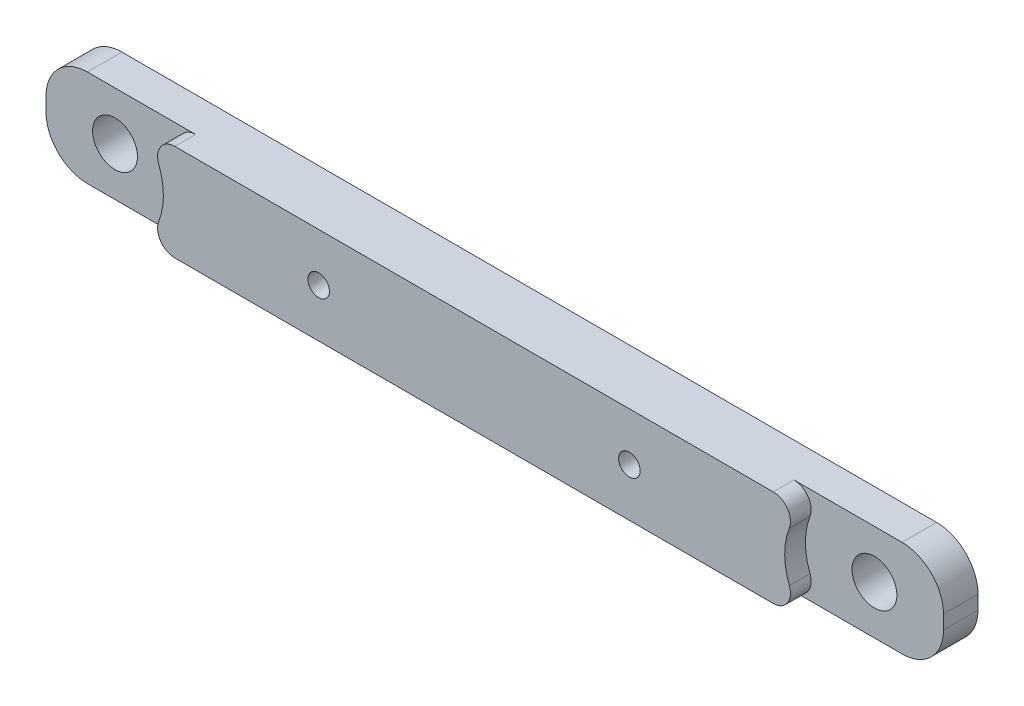
ISO-10303-21;
HEADER;
FILE_DESCRIPTION(('STEP AP214'),'2;1');
FILE_NAME('part.step','',(''),(''),'','','');
FILE_SCHEMA(('AUTOMOTIVE_DESIGN { 1 0 10303 214 1 1 1 1 }'));
ENDSEC;
DATA;
#1=APPLICATION_CONTEXT('core data for automotive mechanical design processes');
#2=APPLICATION_PROTOCOL_DEFINITION('international standard','automotive_design',2000,#1);
#3=PRODUCT_CONTEXT('',#1,'mechanical');
#4=PRODUCT('Part','Part','',(#3));
#5=PRODUCT_RELATED_PRODUCT_CATEGORY('part','',(#4));
#6=PRODUCT_DEFINITION_FORMATION('','',#4);
#7=PRODUCT_DEFINITION_CONTEXT('part definition',#1,'design');
#8=PRODUCT_DEFINITION('design','',#6,#7);
#9=PRODUCT_DEFINITION_SHAPE('','',#8);
#10=(LENGTH_UNIT() NAMED_UNIT(*) SI_UNIT(.MILLI.,.METRE.));
#11=(NAMED_UNIT(*) PLANE_ANGLE_UNIT() SI_UNIT($,.RADIAN.));
#12=(NAMED_UNIT(*) SI_UNIT($,.STERADIAN.) SOLID_ANGLE_UNIT());
#13=UNCERTAINTY_MEASURE_WITH_UNIT(LENGTH_MEASURE(1.E-05),#10,'distance_accuracy_value','');
#14=(GEOMETRIC_REPRESENTATION_CONTEXT(3) GLOBAL_UNCERTAINTY_ASSIGNED_CONTEXT((#13)) GLOBAL_UNIT_ASSIGNED_CONTEXT((#10,
#11,#12)) REPRESENTATION_CONTEXT('',''));
#15=CARTESIAN_POINT('',(0.,0.,0.));
#16=DIRECTION('',(0.,0.,1.));
#17=DIRECTION('',(1.,0.,0.));
#18=AXIS2_PLACEMENT_3D('',#15,#16,#17);
#19=CARTESIAN_POINT('',(-55.,0.,-25.05));
#20=DIRECTION('',(0.,0.,-1.));
#21=DIRECTION('',(1.,0.,0.));
#22=AXIS2_PLACEMENT_3D('',#19,#20,#21);
#23=CYLINDRICAL_SURFACE('',#22,3.25);
#24=CARTESIAN_POINT('',(-55.,0.,-33.05));
#25=DIRECTION('',(0.,0.,1.));
#26=DIRECTION('',(1.,0.,0.));
#27=AXIS2_PLACEMENT_3D('',#24,#25,#26);
#28=CIRCLE('',#27,3.25);
#29=CARTESIAN_POINT('',(-58.25,0.,-33.05));
#30=VERTEX_POINT('',#29);
#31=EDGE_CURVE('E237',#30,#30,#28,.T.);
#32=ORIENTED_EDGE('',*,*,#31,.F.);
#33=DIRECTION('',(0.,0.,1.));
#34=VECTOR('',#33,1.);
#35=CARTESIAN_POINT('',(-58.25,0.,-25.05));
#36=LINE('',#35,#34);
#37=CARTESIAN_POINT('',(-58.25,0.,-28.05));
#38=VERTEX_POINT('',#37);
#39=EDGE_CURVE('E11',#30,#38,#36,.T.);
#40=ORIENTED_EDGE('',*,*,#39,.T.);
#41=CARTESIAN_POINT('',(-55.,0.,-28.05));
#42=DIRECTION('',(0.,0.,1.));
#43=DIRECTION('',(1.,0.,0.));
#44=AXIS2_PLACEMENT_3D('',#41,#42,#43);
#45=CIRCLE('',#44,3.25);
#46=EDGE_CURVE('E293',#38,#38,#45,.T.);
#47=ORIENTED_EDGE('',*,*,#46,.T.);
#48=ORIENTED_EDGE('',*,*,#39,.F.);
#49=EDGE_LOOP('',(#32,#40,#47,#48));
#50=FACE_BOUND('',#49,.T.);
#51=ADVANCED_FACE('F16',(#50),#23,.F.);
#52=CARTESIAN_POINT('',(55.,0.,-25.05));
#53=DIRECTION('',(0.,0.,-1.));
#54=DIRECTION('',(1.,0.,0.));
#55=AXIS2_PLACEMENT_3D('',#52,#53,#54);
#56=CYLINDRICAL_SURFACE('',#55,3.25);
#57=CARTESIAN_POINT('',(55.,0.,-33.05));
#58=DIRECTION('',(0.,0.,1.));
#59=DIRECTION('',(1.,0.,0.));
#60=AXIS2_PLACEMENT_3D('',#57,#58,#59);
#61=CIRCLE('',#60,3.25);
#62=CARTESIAN_POINT('',(51.75,0.,-33.05));
#63=VERTEX_POINT('',#62);
#64=EDGE_CURVE('E212',#63,#63,#61,.T.);
#65=ORIENTED_EDGE('',*,*,#64,.F.);
#66=DIRECTION('',(0.,0.,1.));
#67=VECTOR('',#66,1.);
#68=CARTESIAN_POINT('',(51.75,0.,-25.05));
#69=LINE('',#68,#67);
#70=CARTESIAN_POINT('',(51.75,0.,-28.05));
#71=VERTEX_POINT('',#70);
#72=EDGE_CURVE('E27',#63,#71,#69,.T.);
#73=ORIENTED_EDGE('',*,*,#72,.T.);
#74=CARTESIAN_POINT('',(55.,0.,-28.05));
#75=DIRECTION('',(0.,0.,1.));
#76=DIRECTION('',(1.,0.,0.));
#77=AXIS2_PLACEMENT_3D('',#74,#75,#76);
#78=CIRCLE('',#77,3.25);
#79=EDGE_CURVE('E248',#71,#71,#78,.T.);
#80=ORIENTED_EDGE('',*,*,#79,.T.);
#81=ORIENTED_EDGE('',*,*,#72,.F.);
#82=EDGE_LOOP('',(#65,#73,#80,#81));
#83=FACE_BOUND('',#82,.T.);
#84=ADVANCED_FACE('F902',(#83),#56,.F.);
#85=CARTESIAN_POINT('',(59.,1.,-25.05));
#86=DIRECTION('',(0.,0.,-1.));
#87=DIRECTION('',(0.707106781186547,0.707106781186548,0.));
#88=AXIS2_PLACEMENT_3D('',#85,#86,#87);
#89=CYLINDRICAL_SURFACE('',#88,6.);
#90=CARTESIAN_POINT('',(59.,1.,-28.05));
#91=DIRECTION('',(0.,0.,-1.));
#92=DIRECTION('',(0.707106781186547,0.707106781186548,0.));
#93=AXIS2_PLACEMENT_3D('',#90,#91,#92);
#94=CIRCLE('',#93,6.);
#95=CARTESIAN_POINT('',(59.,7.,-28.05));
#96=VERTEX_POINT('',#95);
#97=CARTESIAN_POINT('',(65.,1.,-28.05));
#98=VERTEX_POINT('',#97);
#99=EDGE_CURVE('E279',#96,#98,#94,.T.);
#100=ORIENTED_EDGE('',*,*,#99,.T.);
#101=DIRECTION('',(0.,0.,-1.));
#102=VECTOR('',#101,1.);
#103=CARTESIAN_POINT('',(65.,1.,-25.05));
#104=LINE('',#103,#102);
#105=CARTESIAN_POINT('',(65.,1.,-33.05));
#106=VERTEX_POINT('',#105);
#107=EDGE_CURVE('E345',#98,#106,#104,.T.);
#108=ORIENTED_EDGE('',*,*,#107,.T.);
#109=CARTESIAN_POINT('',(59.,1.,-33.05));
#110=DIRECTION('',(0.,0.,-1.));
#111=DIRECTION('',(0.707106781186547,0.707106781186548,0.));
#112=AXIS2_PLACEMENT_3D('',#109,#110,#111);
#113=CIRCLE('',#112,6.);
#114=CARTESIAN_POINT('',(59.,7.,-33.05));
#115=VERTEX_POINT('',#114);
#116=EDGE_CURVE('E223',#115,#106,#113,.T.);
#117=ORIENTED_EDGE('',*,*,#116,.F.);
#118=DIRECTION('',(0.,0.,1.));
#119=VECTOR('',#118,1.);
#120=CARTESIAN_POINT('',(59.,7.,-25.05));
#121=LINE('',#120,#119);
#122=EDGE_CURVE('E244',#115,#96,#121,.T.);
#123=ORIENTED_EDGE('',*,*,#122,.T.);
#124=EDGE_LOOP('',(#100,#108,#117,#123));
#125=FACE_BOUND('',#124,.T.);
#126=ADVANCED_FACE('F894',(#125),#89,.T.);
#127=CARTESIAN_POINT('',(65.,7.,-25.05));
#128=DIRECTION('',(1.,0.,0.));
#129=DIRECTION('',(0.,1.,0.));
#130=AXIS2_PLACEMENT_3D('',#127,#128,#129);
#131=PLANE('',#130);
#132=DIRECTION('',(0.,-1.,0.));
#133=VECTOR('',#132,1.);
#134=CARTESIAN_POINT('',(65.,3.5,-28.05));
#135=LINE('',#134,#133);
#136=CARTESIAN_POINT('',(65.,-1.,-28.05));
#137=VERTEX_POINT('',#136);
#138=EDGE_CURVE('E276',#98,#137,#135,.T.);
#139=ORIENTED_EDGE('',*,*,#138,.T.);
#140=DIRECTION('',(0.,0.,1.));
#141=VECTOR('',#140,1.);
#142=CARTESIAN_POINT('',(65.,-1.,-25.05));
#143=LINE('',#142,#141);
#144=CARTESIAN_POINT('',(65.,-1.,-33.05));
#145=VERTEX_POINT('',#144);
#146=EDGE_CURVE('E20',#145,#137,#143,.T.);
#147=ORIENTED_EDGE('',*,*,#146,.F.);
#148=DIRECTION('',(0.,-1.,0.));
#149=VECTOR('',#148,1.);
#150=CARTESIAN_POINT('',(65.,7.,-33.05));
#151=LINE('',#150,#149);
#152=EDGE_CURVE('E227',#106,#145,#151,.T.);
#153=ORIENTED_EDGE('',*,*,#152,.F.);
#154=ORIENTED_EDGE('',*,*,#107,.F.);
#155=EDGE_LOOP('',(#139,#147,#153,#154));
#156=FACE_BOUND('',#155,.T.);
#157=ADVANCED_FACE('F494',(#156),#131,.T.);
#158=CARTESIAN_POINT('',(59.,-1.,-25.05));
#159=DIRECTION('',(0.,0.,-1.));
#160=DIRECTION('',(0.707106781186547,-0.707106781186548,0.));
#161=AXIS2_PLACEMENT_3D('',#158,#159,#160);
#162=CYLINDRICAL_SURFACE('',#161,6.);
#163=CARTESIAN_POINT('',(59.,-1.,-28.05));
#164=DIRECTION('',(0.,0.,-1.));
#165=DIRECTION('',(0.707106781186547,-0.707106781186548,0.));
#166=AXIS2_PLACEMENT_3D('',#163,#164,#165);
#167=CIRCLE('',#166,6.);
#168=CARTESIAN_POINT('',(59.,-7.,-28.05));
#169=VERTEX_POINT('',#168);
#170=EDGE_CURVE('E273',#137,#169,#167,.T.);
#171=ORIENTED_EDGE('',*,*,#170,.T.);
#172=DIRECTION('',(0.,0.,-1.));
#173=VECTOR('',#172,1.);
#174=CARTESIAN_POINT('',(59.,-7.,-25.05));
#175=LINE('',#174,#173);
#176=CARTESIAN_POINT('',(59.,-7.,-33.05));
#177=VERTEX_POINT('',#176);
#178=EDGE_CURVE('E217',#169,#177,#175,.T.);
#179=ORIENTED_EDGE('',*,*,#178,.T.);
#180=CARTESIAN_POINT('',(59.,-1.,-33.05));
#181=DIRECTION('',(0.,0.,-1.));
#182=DIRECTION('',(0.707106781186547,-0.707106781186548,0.));
#183=AXIS2_PLACEMENT_3D('',#180,#181,#182);
#184=CIRCLE('',#183,6.);
#185=EDGE_CURVE('E229',#145,#177,#184,.T.);
#186=ORIENTED_EDGE('',*,*,#185,.F.);
#187=ORIENTED_EDGE('',*,*,#146,.T.);
#188=EDGE_LOOP('',(#171,#179,#186,#187));
#189=FACE_BOUND('',#188,.T.);
#190=ADVANCED_FACE('F513',(#189),#162,.T.);
#191=CARTESIAN_POINT('',(-59.,1.,-25.05));
#192=DIRECTION('',(0.,0.,-1.));
#193=DIRECTION('',(-0.707106781186547,0.707106781186548,0.));
#194=AXIS2_PLACEMENT_3D('',#191,#192,#193);
#195=CYLINDRICAL_SURFACE('',#194,6.);
#196=CARTESIAN_POINT('',(-59.,1.,-28.05));
#197=DIRECTION('',(0.,0.,-1.));
#198=DIRECTION('',(-0.707106781186547,0.707106781186548,0.));
#199=AXIS2_PLACEMENT_3D('',#196,#197,#198);
#200=CIRCLE('',#199,6.);
#201=CARTESIAN_POINT('',(-65.,1.,-28.05));
#202=VERTEX_POINT('',#201);
#203=CARTESIAN_POINT('',(-59.,7.,-28.05));
#204=VERTEX_POINT('',#203);
#205=EDGE_CURVE('E292',#202,#204,#200,.T.);
#206=ORIENTED_EDGE('',*,*,#205,.T.);
#207=DIRECTION('',(0.,0.,-1.));
#208=VECTOR('',#207,1.);
#209=CARTESIAN_POINT('',(-59.,7.,-25.05));
#210=LINE('',#209,#208);
#211=CARTESIAN_POINT('',(-59.,7.,-33.05));
#212=VERTEX_POINT('',#211);
#213=EDGE_CURVE('E247',#204,#212,#210,.T.);
#214=ORIENTED_EDGE('',*,*,#213,.T.);
#215=CARTESIAN_POINT('',(-59.,1.,-33.05));
#216=DIRECTION('',(0.,0.,-1.));
#217=DIRECTION('',(-0.707106781186547,0.707106781186548,0.));
#218=AXIS2_PLACEMENT_3D('',#215,#216,#217);
#219=CIRCLE('',#218,6.);
#220=CARTESIAN_POINT('',(-65.,1.,-33.05));
#221=VERTEX_POINT('',#220);
#222=EDGE_CURVE('E328',#221,#212,#219,.T.);
#223=ORIENTED_EDGE('',*,*,#222,.F.);
#224=DIRECTION('',(0.,0.,1.));
#225=VECTOR('',#224,1.);
#226=CARTESIAN_POINT('',(-65.,1.,-25.05));
#227=LINE('',#226,#225);
#228=EDGE_CURVE('E342',#221,#202,#227,.T.);
#229=ORIENTED_EDGE('',*,*,#228,.T.);
#230=EDGE_LOOP('',(#206,#214,#223,#229));
#231=FACE_BOUND('',#230,.T.);
#232=ADVANCED_FACE('F524',(#231),#195,.T.);
#233=CARTESIAN_POINT('',(-65.,-7.,-25.05));
#234=DIRECTION('',(-1.,0.,0.));
#235=DIRECTION('',(0.,0.,1.));
#236=AXIS2_PLACEMENT_3D('',#233,#234,#235);
#237=PLANE('',#236);
#238=DIRECTION('',(0.,1.,0.));
#239=VECTOR('',#238,1.);
#240=CARTESIAN_POINT('',(-65.,-3.5,-28.05));
#241=LINE('',#240,#239);
#242=CARTESIAN_POINT('',(-65.,-1.,-28.05));
#243=VERTEX_POINT('',#242);
#244=EDGE_CURVE('E287',#243,#202,#241,.T.);
#245=ORIENTED_EDGE('',*,*,#244,.T.);
#246=ORIENTED_EDGE('',*,*,#228,.F.);
#247=DIRECTION('',(0.,1.,0.));
#248=VECTOR('',#247,1.);
#249=CARTESIAN_POINT('',(-65.,-7.,-33.05));
#250=LINE('',#249,#248);
#251=CARTESIAN_POINT('',(-65.,-1.,-33.05));
#252=VERTEX_POINT('',#251);
#253=EDGE_CURVE('E301',#252,#221,#250,.T.);
#254=ORIENTED_EDGE('',*,*,#253,.F.);
#255=DIRECTION('',(0.,0.,-1.));
#256=VECTOR('',#255,1.);
#257=CARTESIAN_POINT('',(-65.,-1.,-25.05));
#258=LINE('',#257,#256);
#259=EDGE_CURVE('E324',#243,#252,#258,.T.);
#260=ORIENTED_EDGE('',*,*,#259,.F.);
#261=EDGE_LOOP('',(#245,#246,#254,#260));
#262=FACE_BOUND('',#261,.T.);
#263=ADVANCED_FACE('F521',(#262),#237,.T.);
#264=CARTESIAN_POINT('',(-59.,-1.,-25.05));
#265=DIRECTION('',(0.,0.,-1.));
#266=DIRECTION('',(-0.707106781186547,-0.707106781186548,0.));
#267=AXIS2_PLACEMENT_3D('',#264,#265,#266);
#268=CYLINDRICAL_SURFACE('',#267,6.);
#269=CARTESIAN_POINT('',(-59.,-1.,-28.05));
#270=DIRECTION('',(0.,0.,-1.));
#271=DIRECTION('',(-0.707106781186547,-0.707106781186548,0.));
#272=AXIS2_PLACEMENT_3D('',#269,#270,#271);
#273=CIRCLE('',#272,6.);
#274=CARTESIAN_POINT('',(-59.,-7.,-28.05));
#275=VERTEX_POINT('',#274);
#276=EDGE_CURVE('E291',#275,#243,#273,.T.);
#277=ORIENTED_EDGE('',*,*,#276,.T.);
#278=ORIENTED_EDGE('',*,*,#259,.T.);
#279=CARTESIAN_POINT('',(-59.,-1.,-33.05));
#280=DIRECTION('',(0.,0.,-1.));
#281=DIRECTION('',(-0.707106781186547,-0.707106781186548,0.));
#282=AXIS2_PLACEMENT_3D('',#279,#280,#281);
#283=CIRCLE('',#282,6.);
#284=CARTESIAN_POINT('',(-59.,-7.,-33.05));
#285=VERTEX_POINT('',#284);
#286=EDGE_CURVE('E297',#285,#252,#283,.T.);
#287=ORIENTED_EDGE('',*,*,#286,.F.);
#288=DIRECTION('',(0.,0.,1.));
#289=VECTOR('',#288,1.);
#290=CARTESIAN_POINT('',(-59.,-7.,-25.05));
#291=LINE('',#290,#289);
#292=EDGE_CURVE('E221',#285,#275,#291,.T.);
#293=ORIENTED_EDGE('',*,*,#292,.T.);
#294=EDGE_LOOP('',(#277,#278,#287,#293));
#295=FACE_BOUND('',#294,.T.);
#296=ADVANCED_FACE('F518',(#295),#268,.T.);
#297=CARTESIAN_POINT('',(-65.,7.,-25.05));
#298=DIRECTION('',(0.,1.,0.));
#299=DIRECTION('',(1.,0.,0.));
#300=AXIS2_PLACEMENT_3D('',#297,#298,#299);
#301=PLANE('',#300);
#302=DIRECTION('',(1.,0.,0.));
#303=VECTOR('',#302,1.);
#304=CARTESIAN_POINT('',(-5.,7.,-28.05));
#305=LINE('',#304,#303);
#306=CARTESIAN_POINT('',(43.3380962103094,7.,-28.05));
#307=VERTEX_POINT('',#306);
#308=EDGE_CURVE('E196',#307,#96,#305,.T.);
#309=ORIENTED_EDGE('',*,*,#308,.T.);
#310=ORIENTED_EDGE('',*,*,#122,.F.);
#311=DIRECTION('',(1.,0.,0.));
#312=VECTOR('',#311,1.);
#313=CARTESIAN_POINT('',(-65.,7.,-33.05));
#314=LINE('',#313,#312);
#315=EDGE_CURVE('E228',#212,#115,#314,.T.);
#316=ORIENTED_EDGE('',*,*,#315,.F.);
#317=ORIENTED_EDGE('',*,*,#213,.F.);
#318=DIRECTION('',(1.,0.,0.));
#319=VECTOR('',#318,1.);
#320=CARTESIAN_POINT('',(-60.,7.,-28.05));
#321=LINE('',#320,#319);
#322=CARTESIAN_POINT('',(-43.3380962103094,7.,-28.05));
#323=VERTEX_POINT('',#322);
#324=EDGE_CURVE('E337',#204,#323,#321,.T.);
#325=ORIENTED_EDGE('',*,*,#324,.T.);
#326=DIRECTION('',(0.,0.,-1.));
#327=VECTOR('',#326,1.);
#328=CARTESIAN_POINT('',(-43.3380962103094,7.,-25.05));
#329=LINE('',#328,#327);
#330=CARTESIAN_POINT('',(-43.3380962103094,7.,-25.05));
#331=VERTEX_POINT('',#330);
#332=EDGE_CURVE('E220',#331,#323,#329,.T.);
#333=ORIENTED_EDGE('',*,*,#332,.F.);
#334=DIRECTION('',(1.,0.,0.));
#335=VECTOR('',#334,1.);
#336=CARTESIAN_POINT('',(-65.,7.,-25.05));
#337=LINE('',#336,#335);
#338=CARTESIAN_POINT('',(43.3380962103094,7.,-25.05));
#339=VERTEX_POINT('',#338);
#340=EDGE_CURVE('E189',#331,#339,#337,.T.);
#341=ORIENTED_EDGE('',*,*,#340,.T.);
#342=DIRECTION('',(0.,0.,1.));
#343=VECTOR('',#342,1.);
#344=CARTESIAN_POINT('',(43.3380962103094,7.,-25.05));
#345=LINE('',#344,#343);
#346=EDGE_CURVE('E201',#307,#339,#345,.T.);
#347=ORIENTED_EDGE('',*,*,#346,.F.);
#348=EDGE_LOOP('',(#309,#310,#316,#317,#325,#333,#341,#347));
#349=FACE_BOUND('',#348,.T.);
#350=ADVANCED_FACE('F18',(#349),#301,.T.);
#351=CARTESIAN_POINT('',(55.,0.,-28.05));
#352=DIRECTION('',(0.,0.,1.));
#353=DIRECTION('',(1.,0.,0.));
#354=AXIS2_PLACEMENT_3D('',#351,#352,#353);
#355=PLANE('',#354);
#356=ORIENTED_EDGE('',*,*,#79,.F.);
#357=EDGE_LOOP('',(#356));
#358=FACE_BOUND('',#357,.T.);
#359=ORIENTED_EDGE('',*,*,#308,.F.);
#360=CARTESIAN_POINT('',(43.3380962103094,4.5,-28.05));
#361=DIRECTION('',(0.,0.,1.));
#362=DIRECTION('',(0.824621125123532,0.565685424949238,0.));
#363=AXIS2_PLACEMENT_3D('',#360,#361,#362);
#364=CIRCLE('',#363,2.5);
#365=CARTESIAN_POINT('',(45.6704769682475,3.6,-28.05));
#366=VERTEX_POINT('',#365);
#367=EDGE_CURVE('E192',#366,#307,#364,.T.);
#368=ORIENTED_EDGE('',*,*,#367,.F.);
#369=CARTESIAN_POINT('',(55.,0.,-28.05));
#370=DIRECTION('',(0.,0.,-1.));
#371=DIRECTION('',(0.,1.,0.));
#372=AXIS2_PLACEMENT_3D('',#369,#370,#371);
#373=CIRCLE('',#372,10.);
#374=CARTESIAN_POINT('',(45.6704769682475,-3.6,-28.05));
#375=VERTEX_POINT('',#374);
#376=EDGE_CURVE('E176',#375,#366,#373,.T.);
#377=ORIENTED_EDGE('',*,*,#376,.F.);
#378=CARTESIAN_POINT('',(43.3380962103094,-4.5,-28.05));
#379=DIRECTION('',(0.,0.,1.));
#380=DIRECTION('',(0.824621125123533,-0.565685424949237,0.));
#381=AXIS2_PLACEMENT_3D('',#378,#379,#380);
#382=CIRCLE('',#381,2.5);
#383=CARTESIAN_POINT('',(43.3380962103094,-7.,-28.05));
#384=VERTEX_POINT('',#383);
#385=EDGE_CURVE('E252',#384,#375,#382,.T.);
#386=ORIENTED_EDGE('',*,*,#385,.F.);
#387=DIRECTION('',(-1.,0.,0.));
#388=VECTOR('',#387,1.);
#389=CARTESIAN_POINT('',(60.,-7.,-28.05));
#390=LINE('',#389,#388);
#391=EDGE_CURVE('E253',#169,#384,#390,.T.);
#392=ORIENTED_EDGE('',*,*,#391,.F.);
#393=ORIENTED_EDGE('',*,*,#170,.F.);
#394=ORIENTED_EDGE('',*,*,#138,.F.);
#395=ORIENTED_EDGE('',*,*,#99,.F.);
#396=EDGE_LOOP('',(#359,#368,#377,#386,#392,#393,#394,#395));
#397=FACE_BOUND('',#396,.T.);
#398=ADVANCED_FACE('F193',(#358,#397),#355,.T.);
#399=CARTESIAN_POINT('',(-55.,0.,-28.05));
#400=DIRECTION('',(0.,0.,1.));
#401=DIRECTION('',(1.,0.,0.));
#402=AXIS2_PLACEMENT_3D('',#399,#400,#401);
#403=PLANE('',#402);
#404=ORIENTED_EDGE('',*,*,#46,.F.);
#405=EDGE_LOOP('',(#404));
#406=FACE_BOUND('',#405,.T.);
#407=DIRECTION('',(-1.,0.,0.));
#408=VECTOR('',#407,1.);
#409=CARTESIAN_POINT('',(5.,-7.,-28.05));
#410=LINE('',#409,#408);
#411=CARTESIAN_POINT('',(-43.3380962103094,-7.,-28.05));
#412=VERTEX_POINT('',#411);
#413=EDGE_CURVE('E465',#412,#275,#410,.T.);
#414=ORIENTED_EDGE('',*,*,#413,.F.);
#415=CARTESIAN_POINT('',(-43.3380962103094,-4.5,-28.05));
#416=DIRECTION('',(0.,0.,1.));
#417=DIRECTION('',(-0.824621125123532,-0.565685424949238,0.));
#418=AXIS2_PLACEMENT_3D('',#415,#416,#417);
#419=CIRCLE('',#418,2.5);
#420=CARTESIAN_POINT('',(-45.6704769682475,-3.6,-28.05));
#421=VERTEX_POINT('',#420);
#422=EDGE_CURVE('E261',#421,#412,#419,.T.);
#423=ORIENTED_EDGE('',*,*,#422,.F.);
#424=CARTESIAN_POINT('',(-55.,0.,-28.05));
#425=DIRECTION('',(0.,0.,-1.));
#426=DIRECTION('',(0.,-1.,0.));
#427=AXIS2_PLACEMENT_3D('',#424,#425,#426);
#428=CIRCLE('',#427,10.);
#429=CARTESIAN_POINT('',(-45.6704769682475,3.6,-28.05));
#430=VERTEX_POINT('',#429);
#431=EDGE_CURVE('E262',#430,#421,#428,.T.);
#432=ORIENTED_EDGE('',*,*,#431,.F.);
#433=CARTESIAN_POINT('',(-43.3380962103094,4.5,-28.05));
#434=DIRECTION('',(0.,0.,1.));
#435=DIRECTION('',(-0.824621125123532,0.565685424949238,0.));
#436=AXIS2_PLACEMENT_3D('',#433,#434,#435);
#437=CIRCLE('',#436,2.5);
#438=EDGE_CURVE('E272',#323,#430,#437,.T.);
#439=ORIENTED_EDGE('',*,*,#438,.F.);
#440=ORIENTED_EDGE('',*,*,#324,.F.);
#441=ORIENTED_EDGE('',*,*,#205,.F.);
#442=ORIENTED_EDGE('',*,*,#244,.F.);
#443=ORIENTED_EDGE('',*,*,#276,.F.);
#444=EDGE_LOOP('',(#414,#423,#432,#439,#440,#441,#442,#443));
#445=FACE_BOUND('',#444,.T.);
#446=ADVANCED_FACE('F459',(#406,#445),#403,.T.);
#447=CARTESIAN_POINT('',(22.5,0.,-25.05));
#448=DIRECTION('',(0.,0.,-1.));
#449=DIRECTION('',(-1.,0.,0.));
#450=AXIS2_PLACEMENT_3D('',#447,#448,#449);
#451=CYLINDRICAL_SURFACE('',#450,1.5625);
#452=CARTESIAN_POINT('',(22.5,0.,-25.05));
#453=DIRECTION('',(0.,0.,-1.));
#454=DIRECTION('',(-1.,0.,0.));
#455=AXIS2_PLACEMENT_3D('',#452,#453,#454);
#456=CIRCLE('',#455,1.5625);
#457=CARTESIAN_POINT('',(24.0625,0.,-25.05));
#458=VERTEX_POINT('',#457);
#459=EDGE_CURVE('E243',#458,#458,#456,.T.);
#460=ORIENTED_EDGE('',*,*,#459,.F.);
#461=DIRECTION('',(0.,0.,-1.));
#462=VECTOR('',#461,1.);
#463=CARTESIAN_POINT('',(24.0625,0.,-25.05));
#464=LINE('',#463,#462);
#465=CARTESIAN_POINT('',(24.0625,0.,-28.05));
#466=VERTEX_POINT('',#465);
#467=EDGE_CURVE('E334',#458,#466,#464,.T.);
#468=ORIENTED_EDGE('',*,*,#467,.T.);
#469=CARTESIAN_POINT('',(22.5,0.,-28.05));
#470=DIRECTION('',(0.,0.,-1.));
#471=DIRECTION('',(-1.,0.,0.));
#472=AXIS2_PLACEMENT_3D('',#469,#470,#471);
#473=CIRCLE('',#472,1.5625);
#474=EDGE_CURVE('E302',#466,#466,#473,.T.);
#475=ORIENTED_EDGE('',*,*,#474,.T.);
#476=ORIENTED_EDGE('',*,*,#467,.F.);
#477=EDGE_LOOP('',(#460,#468,#475,#476));
#478=FACE_BOUND('',#477,.T.);
#479=ADVANCED_FACE('F369',(#478),#451,.F.);
#480=CARTESIAN_POINT('',(-22.5,0.,-25.05));
#481=DIRECTION('',(0.,0.,-1.));
#482=DIRECTION('',(-1.,0.,0.));
#483=AXIS2_PLACEMENT_3D('',#480,#481,#482);
#484=CYLINDRICAL_SURFACE('',#483,1.5625);
#485=CARTESIAN_POINT('',(-22.5,0.,-25.05));
#486=DIRECTION('',(0.,0.,-1.));
#487=DIRECTION('',(-1.,0.,0.));
#488=AXIS2_PLACEMENT_3D('',#485,#486,#487);
#489=CIRCLE('',#488,1.5625);
#490=CARTESIAN_POINT('',(-20.9375,0.,-25.05));
#491=VERTEX_POINT('',#490);
#492=EDGE_CURVE('E238',#491,#491,#489,.T.);
#493=ORIENTED_EDGE('',*,*,#492,.F.);
#494=DIRECTION('',(0.,0.,-1.));
#495=VECTOR('',#494,1.);
#496=CARTESIAN_POINT('',(-20.9375,0.,-25.05));
#497=LINE('',#496,#495);
#498=CARTESIAN_POINT('',(-20.9375,0.,-28.05));
#499=VERTEX_POINT('',#498);
#500=EDGE_CURVE('E311',#491,#499,#497,.T.);
#501=ORIENTED_EDGE('',*,*,#500,.T.);
#502=CARTESIAN_POINT('',(-22.5,0.,-28.05));
#503=DIRECTION('',(0.,0.,-1.));
#504=DIRECTION('',(-1.,0.,0.));
#505=AXIS2_PLACEMENT_3D('',#502,#503,#504);
#506=CIRCLE('',#505,1.5625);
#507=EDGE_CURVE('E341',#499,#499,#506,.T.);
#508=ORIENTED_EDGE('',*,*,#507,.T.);
#509=ORIENTED_EDGE('',*,*,#500,.F.);
#510=EDGE_LOOP('',(#493,#501,#508,#509));
#511=FACE_BOUND('',#510,.T.);
#512=ADVANCED_FACE('F820',(#511),#484,.F.);
#513=CARTESIAN_POINT('',(-43.3380962103094,-4.5,-25.05));
#514=DIRECTION('',(0.,0.,-1.));
#515=DIRECTION('',(-0.824621125123532,-0.565685424949238,0.));
#516=AXIS2_PLACEMENT_3D('',#513,#514,#515);
#517=CYLINDRICAL_SURFACE('',#516,2.5);
#518=CARTESIAN_POINT('',(-43.3380962103094,-4.5,-25.05));
#519=DIRECTION('',(0.,0.,-1.));
#520=DIRECTION('',(-0.824621125123532,-0.565685424949238,0.));
#521=AXIS2_PLACEMENT_3D('',#518,#519,#520);
#522=CIRCLE('',#521,2.5);
#523=CARTESIAN_POINT('',(-43.3380962103094,-7.,-25.05));
#524=VERTEX_POINT('',#523);
#525=CARTESIAN_POINT('',(-45.6704769682475,-3.6,-25.05));
#526=VERTEX_POINT('',#525);
#527=EDGE_CURVE('E354',#524,#526,#522,.T.);
#528=ORIENTED_EDGE('',*,*,#527,.T.);
#529=DIRECTION('',(0.,0.,-1.));
#530=VECTOR('',#529,1.);
#531=CARTESIAN_POINT('',(-45.6704769682475,-3.6,-25.05));
#532=LINE('',#531,#530);
#533=EDGE_CURVE('E257',#526,#421,#532,.T.);
#534=ORIENTED_EDGE('',*,*,#533,.T.);
#535=ORIENTED_EDGE('',*,*,#422,.T.);
#536=DIRECTION('',(0.,0.,1.));
#537=VECTOR('',#536,1.);
#538=CARTESIAN_POINT('',(-43.3380962103094,-7.,-25.05));
#539=LINE('',#538,#537);
#540=EDGE_CURVE('E256',#412,#524,#539,.T.);
#541=ORIENTED_EDGE('',*,*,#540,.T.);
#542=EDGE_LOOP('',(#528,#534,#535,#541));
#543=FACE_BOUND('',#542,.T.);
#544=ADVANCED_FACE('F542',(#543),#517,.T.);
#545=CARTESIAN_POINT('',(-55.,0.,-25.05));
#546=DIRECTION('',(0.,0.,-1.));
#547=DIRECTION('',(0.,-1.,0.));
#548=AXIS2_PLACEMENT_3D('',#545,#546,#547);
#549=CYLINDRICAL_SURFACE('',#548,10.);
#550=DIRECTION('',(0.,0.,1.));
#551=VECTOR('',#550,1.);
#552=CARTESIAN_POINT('',(-45.6704769682475,3.6,-25.05));
#553=LINE('',#552,#551);
#554=CARTESIAN_POINT('',(-45.6704769682475,3.6,-25.05));
#555=VERTEX_POINT('',#554);
#556=EDGE_CURVE('E269',#430,#555,#553,.T.);
#557=ORIENTED_EDGE('',*,*,#556,.F.);
#558=ORIENTED_EDGE('',*,*,#431,.T.);
#559=ORIENTED_EDGE('',*,*,#533,.F.);
#560=CARTESIAN_POINT('',(-55.,0.,-25.05));
#561=DIRECTION('',(0.,0.,-1.));
#562=DIRECTION('',(0.,-1.,0.));
#563=AXIS2_PLACEMENT_3D('',#560,#561,#562);
#564=CIRCLE('',#563,10.);
#565=EDGE_CURVE('E216',#555,#526,#564,.T.);
#566=ORIENTED_EDGE('',*,*,#565,.F.);
#567=EDGE_LOOP('',(#557,#558,#559,#566));
#568=FACE_BOUND('',#567,.T.);
#569=ADVANCED_FACE('F544',(#568),#549,.F.);
#570=CARTESIAN_POINT('',(-43.3380962103094,4.5,-25.05));
#571=DIRECTION('',(0.,0.,1.));
#572=DIRECTION('',(-0.824621125123532,0.565685424949238,0.));
#573=AXIS2_PLACEMENT_3D('',#570,#571,#572);
#574=CYLINDRICAL_SURFACE('',#573,2.5);
#575=CARTESIAN_POINT('',(-43.3380962103094,4.5,-25.05));
#576=DIRECTION('',(0.,0.,-1.));
#577=DIRECTION('',(-0.824621125123532,0.565685424949238,0.));
#578=AXIS2_PLACEMENT_3D('',#575,#576,#577);
#579=CIRCLE('',#578,2.5);
#580=EDGE_CURVE('E280',#555,#331,#579,.T.);
#581=ORIENTED_EDGE('',*,*,#580,.T.);
#582=ORIENTED_EDGE('',*,*,#332,.T.);
#583=ORIENTED_EDGE('',*,*,#438,.T.);
#584=ORIENTED_EDGE('',*,*,#556,.T.);
#585=EDGE_LOOP('',(#581,#582,#583,#584));
#586=FACE_BOUND('',#585,.T.);
#587=ADVANCED_FACE('F531',(#586),#574,.T.);
#588=CARTESIAN_POINT('',(65.,-7.,-25.05));
#589=DIRECTION('',(0.,-1.,0.));
#590=DIRECTION('',(0.,0.,-1.));
#591=AXIS2_PLACEMENT_3D('',#588,#589,#590);
#592=PLANE('',#591);
#593=ORIENTED_EDGE('',*,*,#391,.T.);
#594=DIRECTION('',(0.,0.,-1.));
#595=VECTOR('',#594,1.);
#596=CARTESIAN_POINT('',(43.3380962103094,-7.,-25.05));
#597=LINE('',#596,#595);
#598=CARTESIAN_POINT('',(43.3380962103094,-7.,-25.05));
#599=VERTEX_POINT('',#598);
#600=EDGE_CURVE('E242',#599,#384,#597,.T.);
#601=ORIENTED_EDGE('',*,*,#600,.F.);
#602=DIRECTION('',(-1.,0.,0.));
#603=VECTOR('',#602,1.);
#604=CARTESIAN_POINT('',(65.,-7.,-25.05));
#605=LINE('',#604,#603);
#606=EDGE_CURVE('E349',#599,#524,#605,.T.);
#607=ORIENTED_EDGE('',*,*,#606,.T.);
#608=ORIENTED_EDGE('',*,*,#540,.F.);
#609=ORIENTED_EDGE('',*,*,#413,.T.);
#610=ORIENTED_EDGE('',*,*,#292,.F.);
#611=DIRECTION('',(-1.,0.,0.));
#612=VECTOR('',#611,1.);
#613=CARTESIAN_POINT('',(65.,-7.,-33.05));
#614=LINE('',#613,#612);
#615=EDGE_CURVE('E233',#177,#285,#614,.T.);
#616=ORIENTED_EDGE('',*,*,#615,.F.);
#617=ORIENTED_EDGE('',*,*,#178,.F.);
#618=EDGE_LOOP('',(#593,#601,#607,#608,#609,#610,#616,#617));
#619=FACE_BOUND('',#618,.T.);
#620=ADVANCED_FACE('F473',(#619),#592,.T.);
#621=CARTESIAN_POINT('',(43.3380962103094,-4.5,-25.05));
#622=DIRECTION('',(0.,0.,1.));
#623=DIRECTION('',(0.824621125123533,-0.565685424949237,0.));
#624=AXIS2_PLACEMENT_3D('',#621,#622,#623);
#625=CYLINDRICAL_SURFACE('',#624,2.5);
#626=CARTESIAN_POINT('',(43.3380962103094,-4.5,-25.05));
#627=DIRECTION('',(0.,0.,-1.));
#628=DIRECTION('',(0.824621125123533,-0.565685424949237,0.));
#629=AXIS2_PLACEMENT_3D('',#626,#627,#628);
#630=CIRCLE('',#629,2.5);
#631=CARTESIAN_POINT('',(45.6704769682475,-3.6,-25.05));
#632=VERTEX_POINT('',#631);
#633=EDGE_CURVE('E353',#632,#599,#630,.T.);
#634=ORIENTED_EDGE('',*,*,#633,.T.);
#635=ORIENTED_EDGE('',*,*,#600,.T.);
#636=ORIENTED_EDGE('',*,*,#385,.T.);
#637=DIRECTION('',(0.,0.,1.));
#638=VECTOR('',#637,1.);
#639=CARTESIAN_POINT('',(45.6704769682475,-3.6,-25.05));
#640=LINE('',#639,#638);
#641=EDGE_CURVE('E185',#375,#632,#640,.T.);
#642=ORIENTED_EDGE('',*,*,#641,.T.);
#643=EDGE_LOOP('',(#634,#635,#636,#642));
#644=FACE_BOUND('',#643,.T.);
#645=ADVANCED_FACE('F540',(#644),#625,.T.);
#646=CARTESIAN_POINT('',(0.,0.,-25.05));
#647=DIRECTION('',(0.,0.,-1.));
#648=DIRECTION('',(0.,-1.,0.));
#649=AXIS2_PLACEMENT_3D('',#646,#647,#648);
#650=PLANE('',#649);
#651=ORIENTED_EDGE('',*,*,#492,.T.);
#652=EDGE_LOOP('',(#651));
#653=FACE_BOUND('',#652,.T.);
#654=ORIENTED_EDGE('',*,*,#459,.T.);
#655=EDGE_LOOP('',(#654));
#656=FACE_BOUND('',#655,.T.);
#657=CARTESIAN_POINT('',(43.3380962103094,4.5,-25.05));
#658=DIRECTION('',(0.,0.,-1.));
#659=DIRECTION('',(0.824621125123532,0.565685424949238,0.));
#660=AXIS2_PLACEMENT_3D('',#657,#658,#659);
#661=CIRCLE('',#660,2.5);
#662=CARTESIAN_POINT('',(45.6704769682475,3.6,-25.05));
#663=VERTEX_POINT('',#662);
#664=EDGE_CURVE('E205',#339,#663,#661,.T.);
#665=ORIENTED_EDGE('',*,*,#664,.F.);
#666=ORIENTED_EDGE('',*,*,#340,.F.);
#667=ORIENTED_EDGE('',*,*,#580,.F.);
#668=ORIENTED_EDGE('',*,*,#565,.T.);
#669=ORIENTED_EDGE('',*,*,#527,.F.);
#670=ORIENTED_EDGE('',*,*,#606,.F.);
#671=ORIENTED_EDGE('',*,*,#633,.F.);
#672=CARTESIAN_POINT('',(55.,0.,-25.05));
#673=DIRECTION('',(0.,0.,-1.));
#674=DIRECTION('',(0.,1.,0.));
#675=AXIS2_PLACEMENT_3D('',#672,#673,#674);
#676=CIRCLE('',#675,10.);
#677=EDGE_CURVE('E422',#632,#663,#676,.T.);
#678=ORIENTED_EDGE('',*,*,#677,.T.);
#679=EDGE_LOOP('',(#665,#666,#667,#668,#669,#670,#671,#678));
#680=FACE_BOUND('',#679,.T.);
#681=ADVANCED_FACE('F363',(#653,#656,#680),#650,.F.);
#682=CARTESIAN_POINT('',(55.,0.,-25.05));
#683=DIRECTION('',(0.,0.,-1.));
#684=DIRECTION('',(0.,1.,0.));
#685=AXIS2_PLACEMENT_3D('',#682,#683,#684);
#686=CYLINDRICAL_SURFACE('',#685,10.);
#687=DIRECTION('',(0.,0.,-1.));
#688=VECTOR('',#687,1.);
#689=CARTESIAN_POINT('',(45.6704769682475,3.6,-25.05));
#690=LINE('',#689,#688);
#691=EDGE_CURVE('E181',#663,#366,#690,.T.);
#692=ORIENTED_EDGE('',*,*,#691,.F.);
#693=ORIENTED_EDGE('',*,*,#677,.F.);
#694=ORIENTED_EDGE('',*,*,#641,.F.);
#695=ORIENTED_EDGE('',*,*,#376,.T.);
#696=EDGE_LOOP('',(#692,#693,#694,#695));
#697=FACE_BOUND('',#696,.T.);
#698=ADVANCED_FACE('F178',(#697),#686,.F.);
#699=CARTESIAN_POINT('',(43.3380962103094,4.5,-25.05));
#700=DIRECTION('',(0.,0.,-1.));
#701=DIRECTION('',(0.824621125123532,0.565685424949238,0.));
#702=AXIS2_PLACEMENT_3D('',#699,#700,#701);
#703=CYLINDRICAL_SURFACE('',#702,2.5);
#704=ORIENTED_EDGE('',*,*,#664,.T.);
#705=ORIENTED_EDGE('',*,*,#691,.T.);
#706=ORIENTED_EDGE('',*,*,#367,.T.);
#707=ORIENTED_EDGE('',*,*,#346,.T.);
#708=EDGE_LOOP('',(#704,#705,#706,#707));
#709=FACE_BOUND('',#708,.T.);
#710=ADVANCED_FACE('F203',(#709),#703,.T.);
#711=CARTESIAN_POINT('',(0.,0.,-33.05));
#712=DIRECTION('',(0.,0.,-1.));
#713=DIRECTION('',(0.,-1.,0.));
#714=AXIS2_PLACEMENT_3D('',#711,#712,#713);
#715=PLANE('',#714);
#716=ORIENTED_EDGE('',*,*,#64,.T.);
#717=EDGE_LOOP('',(#716));
#718=FACE_BOUND('',#717,.T.);
#719=ORIENTED_EDGE('',*,*,#31,.T.);
#720=EDGE_LOOP('',(#719));
#721=FACE_BOUND('',#720,.T.);
#722=CARTESIAN_POINT('',(22.5,0.,-33.05));
#723=DIRECTION('',(0.,0.,1.));
#724=DIRECTION('',(1.,0.,0.));
#725=AXIS2_PLACEMENT_3D('',#722,#723,#724);
#726=CIRCLE('',#725,3.75);
#727=CARTESIAN_POINT('',(18.75,0.,-33.05));
#728=VERTEX_POINT('',#727);
#729=EDGE_CURVE('E384',#728,#728,#726,.T.);
#730=ORIENTED_EDGE('',*,*,#729,.T.);
#731=EDGE_LOOP('',(#730));
#732=FACE_BOUND('',#731,.T.);
#733=CARTESIAN_POINT('',(-22.5,0.,-33.05));
#734=DIRECTION('',(0.,0.,1.));
#735=DIRECTION('',(1.,0.,0.));
#736=AXIS2_PLACEMENT_3D('',#733,#734,#735);
#737=CIRCLE('',#736,3.75);
#738=CARTESIAN_POINT('',(-26.25,0.,-33.05));
#739=VERTEX_POINT('',#738);
#740=EDGE_CURVE('E268',#739,#739,#737,.T.);
#741=ORIENTED_EDGE('',*,*,#740,.T.);
#742=EDGE_LOOP('',(#741));
#743=FACE_BOUND('',#742,.T.);
#744=ORIENTED_EDGE('',*,*,#286,.T.);
#745=ORIENTED_EDGE('',*,*,#253,.T.);
#746=ORIENTED_EDGE('',*,*,#222,.T.);
#747=ORIENTED_EDGE('',*,*,#315,.T.);
#748=ORIENTED_EDGE('',*,*,#116,.T.);
#749=ORIENTED_EDGE('',*,*,#152,.T.);
#750=ORIENTED_EDGE('',*,*,#185,.T.);
#751=ORIENTED_EDGE('',*,*,#615,.T.);
#752=EDGE_LOOP('',(#744,#745,#746,#747,#748,#749,#750,#751));
#753=FACE_BOUND('',#752,.T.);
#754=ADVANCED_FACE('F376',(#718,#721,#732,#743,#753),#715,.T.);
#755=CARTESIAN_POINT('',(22.5,0.,-28.05));
#756=DIRECTION('',(0.,0.,-1.));
#757=DIRECTION('',(0.,-1.,0.));
#758=AXIS2_PLACEMENT_3D('',#755,#756,#757);
#759=PLANE('',#758);
#760=ORIENTED_EDGE('',*,*,#474,.F.);
#761=EDGE_LOOP('',(#760));
#762=FACE_BOUND('',#761,.T.);
#763=CARTESIAN_POINT('',(22.5,0.,-28.05));
#764=DIRECTION('',(0.,0.,1.));
#765=DIRECTION('',(1.,0.,0.));
#766=AXIS2_PLACEMENT_3D('',#763,#764,#765);
#767=CIRCLE('',#766,3.75);
#768=CARTESIAN_POINT('',(18.75,0.,-28.05));
#769=VERTEX_POINT('',#768);
#770=EDGE_CURVE('E312',#769,#769,#767,.T.);
#771=ORIENTED_EDGE('',*,*,#770,.F.);
#772=EDGE_LOOP('',(#771));
#773=FACE_BOUND('',#772,.T.);
#774=ADVANCED_FACE('F372',(#762,#773),#759,.T.);
#775=CARTESIAN_POINT('',(22.5,0.,-33.05));
#776=DIRECTION('',(0.,0.,1.));
#777=DIRECTION('',(1.,0.,0.));
#778=AXIS2_PLACEMENT_3D('',#775,#776,#777);
#779=CYLINDRICAL_SURFACE('',#778,3.75);
#780=ORIENTED_EDGE('',*,*,#729,.F.);
#781=DIRECTION('',(0.,0.,1.));
#782=VECTOR('',#781,1.);
#783=CARTESIAN_POINT('',(18.75,0.,-33.05));
#784=LINE('',#783,#782);
#785=EDGE_CURVE('E315',#728,#769,#784,.T.);
#786=ORIENTED_EDGE('',*,*,#785,.T.);
#787=ORIENTED_EDGE('',*,*,#770,.T.);
#788=ORIENTED_EDGE('',*,*,#785,.F.);
#789=EDGE_LOOP('',(#780,#786,#787,#788));
#790=FACE_BOUND('',#789,.T.);
#791=ADVANCED_FACE('F375',(#790),#779,.F.);
#792=CARTESIAN_POINT('',(-22.5,0.,-28.05));
#793=DIRECTION('',(0.,0.,-1.));
#794=DIRECTION('',(0.,-1.,0.));
#795=AXIS2_PLACEMENT_3D('',#792,#793,#794);
#796=PLANE('',#795);
#797=ORIENTED_EDGE('',*,*,#507,.F.);
#798=EDGE_LOOP('',(#797));
#799=FACE_BOUND('',#798,.T.);
#800=CARTESIAN_POINT('',(-22.5,0.,-28.05));
#801=DIRECTION('',(0.,0.,1.));
#802=DIRECTION('',(1.,0.,0.));
#803=AXIS2_PLACEMENT_3D('',#800,#801,#802);
#804=CIRCLE('',#803,3.75);
#805=CARTESIAN_POINT('',(-26.25,0.,-28.05));
#806=VERTEX_POINT('',#805);
#807=EDGE_CURVE('E267',#806,#806,#804,.T.);
#808=ORIENTED_EDGE('',*,*,#807,.F.);
#809=EDGE_LOOP('',(#808));
#810=FACE_BOUND('',#809,.T.);
#811=ADVANCED_FACE('F711',(#799,#810),#796,.T.);
#812=CARTESIAN_POINT('',(-22.5,0.,-33.05));
#813=DIRECTION('',(0.,0.,1.));
#814=DIRECTION('',(1.,0.,0.));
#815=AXIS2_PLACEMENT_3D('',#812,#813,#814);
#816=CYLINDRICAL_SURFACE('',#815,3.75);
#817=ORIENTED_EDGE('',*,*,#740,.F.);
#818=DIRECTION('',(0.,0.,1.));
#819=VECTOR('',#818,1.);
#820=CARTESIAN_POINT('',(-26.25,0.,-33.05));
#821=LINE('',#820,#819);
#822=EDGE_CURVE('E263',#739,#806,#821,.T.);
#823=ORIENTED_EDGE('',*,*,#822,.T.);
#824=ORIENTED_EDGE('',*,*,#807,.T.);
#825=ORIENTED_EDGE('',*,*,#822,.F.);
#826=EDGE_LOOP('',(#817,#823,#824,#825));
#827=FACE_BOUND('',#826,.T.);
#828=ADVANCED_FACE('F706',(#827),#816,.F.);
#829=CLOSED_SHELL('',(#51,#84,#126,#157,#190,#232,#263,#296,#350,#398,#446,#479,#512,#544,#569,
#587,#620,#645,#681,#698,#710,#754,#774,#791,#811,#828));
#830=MANIFOLD_SOLID_BREP('B1',#829);
#831=ADVANCED_BREP_SHAPE_REPRESENTATION('',(#18,#830),#14);
#832=SHAPE_DEFINITION_REPRESENTATION(#9,#831);
ENDSEC;
END-ISO-10303-21;
